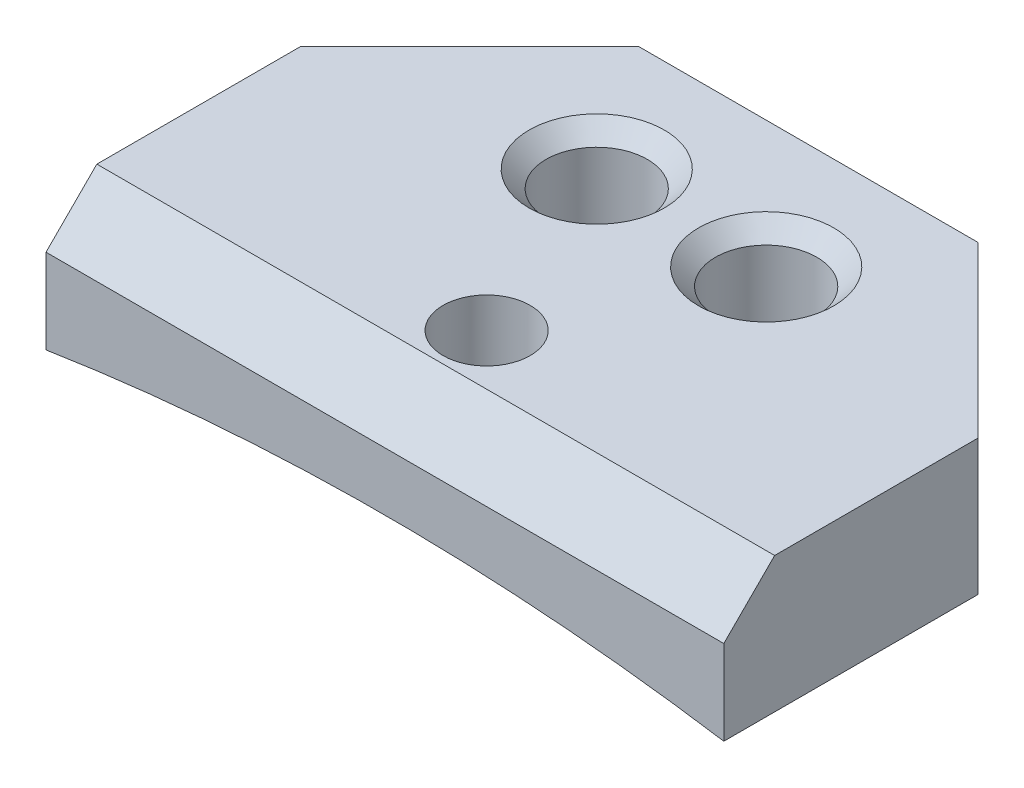
ISO-10303-21;
HEADER;
FILE_DESCRIPTION(('STEP AP214'),'2;1');
FILE_NAME('part.step','',(''),(''),'','','');
FILE_SCHEMA(('AUTOMOTIVE_DESIGN { 1 0 10303 214 1 1 1 1 }'));
ENDSEC;
DATA;
#1=APPLICATION_CONTEXT('core data for automotive mechanical design processes');
#2=APPLICATION_PROTOCOL_DEFINITION('international standard','automotive_design',2000,#1);
#3=PRODUCT_CONTEXT('',#1,'mechanical');
#4=PRODUCT('Part','Part','',(#3));
#5=PRODUCT_RELATED_PRODUCT_CATEGORY('part','',(#4));
#6=PRODUCT_DEFINITION_FORMATION('','',#4);
#7=PRODUCT_DEFINITION_CONTEXT('part definition',#1,'design');
#8=PRODUCT_DEFINITION('design','',#6,#7);
#9=PRODUCT_DEFINITION_SHAPE('','',#8);
#10=(LENGTH_UNIT() NAMED_UNIT(*) SI_UNIT(.MILLI.,.METRE.));
#11=(NAMED_UNIT(*) PLANE_ANGLE_UNIT() SI_UNIT($,.RADIAN.));
#12=(NAMED_UNIT(*) SI_UNIT($,.STERADIAN.) SOLID_ANGLE_UNIT());
#13=UNCERTAINTY_MEASURE_WITH_UNIT(LENGTH_MEASURE(1.E-05),#10,'distance_accuracy_value','');
#14=(GEOMETRIC_REPRESENTATION_CONTEXT(3) GLOBAL_UNCERTAINTY_ASSIGNED_CONTEXT((#13)) GLOBAL_UNIT_ASSIGNED_CONTEXT((#10,
#11,#12)) REPRESENTATION_CONTEXT('',''));
#15=CARTESIAN_POINT('',(0.,0.,0.));
#16=DIRECTION('',(0.,0.,1.));
#17=DIRECTION('',(1.,0.,0.));
#18=AXIS2_PLACEMENT_3D('',#15,#16,#17);
#19=CARTESIAN_POINT('',(-15.8118256986195,-82.8522926659245,20.4922288865617));
#20=DIRECTION('',(0.,0.,-1.));
#21=DIRECTION('',(-1.,0.,0.));
#22=AXIS2_PLACEMENT_3D('',#19,#20,#21);
#23=CYLINDRICAL_SURFACE('',#22,81.9404);
#24=CARTESIAN_POINT('',(-15.810045420452,-0.911892685264051,18.3141788865616));
#25=CARTESIAN_POINT('',(-15.9017029918076,-0.911890913280541,18.3141748249464));
#26=CARTESIAN_POINT('',(-15.9934267954014,-0.912044142317425,18.3064311269966));
#27=CARTESIAN_POINT('',(-16.1743476192574,-0.912644500400301,18.2756478088611));
#28=CARTESIAN_POINT('',(-16.2635414743436,-0.913091982007552,18.2525898394161));
#29=CARTESIAN_POINT('',(-16.4367551740045,-0.914229998136399,18.1918352434671));
#30=CARTESIAN_POINT('',(-16.5207774935506,-0.914920415315425,18.1541456833975));
#31=CARTESIAN_POINT('',(-16.6812787169512,-0.916466232669863,18.0652076708666));
#32=CARTESIAN_POINT('',(-16.7577594750399,-0.917321592137491,18.0139625627589));
#33=CARTESIAN_POINT('',(-16.9010518371877,-0.919101082150089,17.8993502572498));
#34=CARTESIAN_POINT('',(-16.9678612293931,-0.92002522835373,17.8359802945481));
#35=CARTESIAN_POINT('',(-17.0898960764751,-0.921837872119632,17.6989210773848));
#36=CARTESIAN_POINT('',(-17.1451210736124,-0.922726368272116,17.625231415348));
#37=CARTESIAN_POINT('',(-17.2424197786345,-0.924367454272636,17.4696204298715));
#38=CARTESIAN_POINT('',(-17.2844926361657,-0.925120035331733,17.3876985746303));
#39=CARTESIAN_POINT('',(-17.354287036228,-0.926404262754413,17.217952555162));
#40=CARTESIAN_POINT('',(-17.3820086202216,-0.9269359097563,17.1301284079881));
#41=CARTESIAN_POINT('',(-17.4223101287402,-0.927718192822541,16.951083046461));
#42=CARTESIAN_POINT('',(-17.4348920541042,-0.927968866019757,16.8598622826437));
#43=CARTESIAN_POINT('',(-17.4445632358803,-0.92816102707526,16.6766030428427));
#44=CARTESIAN_POINT('',(-17.4416525351291,-0.928102515788437,16.5845645691206));
#45=CARTESIAN_POINT('',(-17.4204228337145,-0.927682946116929,16.4022961558621));
#46=CARTESIAN_POINT('',(-17.402106011651,-0.927321930509808,16.3120659624612));
#47=CARTESIAN_POINT('',(-17.3505873758904,-0.926338152579295,16.1359615106388));
#48=CARTESIAN_POINT('',(-17.317385538961,-0.925715389847375,16.0500872590161));
#49=CARTESIAN_POINT('',(-17.2370368615322,-0.924278337233449,15.8851254307001));
#50=CARTESIAN_POINT('',(-17.1898890216518,-0.923464033626336,15.8060383409042));
#51=CARTESIAN_POINT('',(-17.0829874678764,-0.921735802429861,15.6569012197233));
#52=CARTESIAN_POINT('',(-17.0232337441657,-0.920821874762924,15.5868511953753));
#53=CARTESIAN_POINT('',(-16.8928042780576,-0.918997347350935,15.4577639643707));
#54=CARTESIAN_POINT('',(-16.8221266432536,-0.918086748210534,15.3987286697722));
#55=CARTESIAN_POINT('',(-16.6718623410035,-0.916371818706652,15.2933614343471));
#56=CARTESIAN_POINT('',(-16.5922756723002,-0.915567488358166,15.2470294953128));
#57=CARTESIAN_POINT('',(-16.4264514968363,-0.914155914546316,15.1683844274501));
#58=CARTESIAN_POINT('',(-16.3402139645768,-0.913548671838614,15.1360713523718));
#59=CARTESIAN_POINT('',(-16.1635365230143,-0.912599902052049,15.086382468046));
#60=CARTESIAN_POINT('',(-16.0730966188571,-0.912258374647819,15.0690066405078));
#61=CARTESIAN_POINT('',(-15.8905983716079,-0.911879743399274,15.049687832766));
#62=CARTESIAN_POINT('',(-15.7985403090942,-0.911842587290676,15.0477422030101));
#63=CARTESIAN_POINT('',(-15.6154043620863,-0.912076918082261,15.0593321160648));
#64=CARTESIAN_POINT('',(-15.5243264771189,-0.912348404833392,15.0728676513993));
#65=CARTESIAN_POINT('',(-15.3457436340813,-0.913169551451484,15.1150334773267));
#66=CARTESIAN_POINT('',(-15.2582383936558,-0.913719189289282,15.1436625725391));
#67=CARTESIAN_POINT('',(-15.0892761684698,-0.915034845140963,15.2152016111763));
#68=CARTESIAN_POINT('',(-15.0078191886493,-0.915800863331578,15.2581115662651));
#69=CARTESIAN_POINT('',(-14.85325354451,-0.917463228052602,15.357001101786));
#70=CARTESIAN_POINT('',(-14.7801460252889,-0.918359592421281,15.412982471717));
#71=CARTESIAN_POINT('',(-14.6443660696722,-0.920181682170382,15.5364230907153));
#72=CARTESIAN_POINT('',(-14.5816936473735,-0.921107407590468,15.6038823552881));
#73=CARTESIAN_POINT('',(-14.4685541355325,-0.922884118180135,15.7483751625375));
#74=CARTESIAN_POINT('',(-14.4180887565541,-0.923735092864323,15.8254100447514));
#75=CARTESIAN_POINT('',(-14.3308076008595,-0.925266287412075,15.9868604175185));
#76=CARTESIAN_POINT('',(-14.2939918024863,-0.925946507546564,16.0712758963612));
#77=CARTESIAN_POINT('',(-14.2350578659797,-0.92705949477823,16.2450847055307));
#78=CARTESIAN_POINT('',(-14.2129386086681,-0.927492280717788,16.3344776562487));
#79=CARTESIAN_POINT('',(-14.1840219584635,-0.928061699279848,16.5157093241088));
#80=CARTESIAN_POINT('',(-14.1772245750549,-0.928198331719031,16.6075480427649));
#81=CARTESIAN_POINT('',(-14.1791447913573,-0.928160043683647,16.7910469123331));
#82=CARTESIAN_POINT('',(-14.1878596735206,-0.927985177779546,16.8827070917068));
#83=CARTESIAN_POINT('',(-14.2205514797717,-0.927343705269266,17.0632631870278));
#84=CARTESIAN_POINT('',(-14.2445284343718,-0.92687709807983,17.1521590974483));
#85=CARTESIAN_POINT('',(-14.3070637056319,-0.925704704487211,17.3246650418412));
#86=CARTESIAN_POINT('',(-14.3456222858023,-0.924998913761672,17.4082749802569));
#87=CARTESIAN_POINT('',(-14.4362244097058,-0.923427685215007,17.5678320664825));
#88=CARTESIAN_POINT('',(-14.4882674424335,-0.92256225344398,17.6437795045183));
#89=CARTESIAN_POINT('',(-14.6043656332835,-0.920769101466156,17.785866021643));
#90=CARTESIAN_POINT('',(-14.668421617403,-0.919841376978998,17.8520044257132));
#91=CARTESIAN_POINT('',(-14.8067466642237,-0.918027905096621,17.9726058679948));
#92=CARTESIAN_POINT('',(-14.8810182572159,-0.917142168174562,18.0270660050524));
#93=CARTESIAN_POINT('',(-15.0376862570101,-0.915512178640701,18.1227692620854));
#94=CARTESIAN_POINT('',(-15.1200871326344,-0.914768004514252,18.1640050588505));
#95=CARTESIAN_POINT('',(-15.2905796160932,-0.913506418905138,18.2320095105708));
#96=CARTESIAN_POINT('',(-15.3786642756437,-0.912988736350335,18.2587954685417));
#97=CARTESIAN_POINT('',(-15.5244310144212,-0.912377327161624,18.2900186907092));
#98=CARTESIAN_POINT('',(-15.5811663721117,-0.912197456155807,18.2990674159196));
#99=CARTESIAN_POINT('',(-15.6952743021591,-0.911955690047492,18.3111487852098));
#100=CARTESIAN_POINT('',(-15.7526468744345,-0.911893794929904,18.3141814300592));
#101=CARTESIAN_POINT('',(-15.810045420452,-0.911892685264051,18.3141788865616));
#102=B_SPLINE_CURVE_WITH_KNOTS('',3,(#24,#25,#26,#27,#28,#29,#30,#31,#32,#33,#34,#35,#36,#37,
#38,#39,#40,#41,#42,#43,#44,#45,#46,#47,#48,#49,#50,#51,#52,#53,#54,#55,#56,#57,#58,#59,#60,#61,
#62,#63,#64,#65,#66,#67,#68,#69,#70,#71,#72,#73,#74,#75,#76,#77,#78,#79,#80,#81,#82,#83,#84,#85,
#86,#87,#88,#89,#90,#91,#92,#93,#94,#95,#96,#97,#98,#99,#100,#101),.UNSPECIFIED.,.T.,.F.,(4,2,2,
2,2,2,2,2,2,2,2,2,2,2,2,2,2,2,2,2,2,2,2,2,2,2,2,2,2,2,2,2,2,2,2,2,2,2,4),(0.,0.274763206328043,
0.549856223885478,0.824816548196743,1.09970909890805,1.37466441891012,1.64963060130168,
1.92461455800011,2.19959772023139,2.47454453702401,2.74949059359428,3.02439777621472,
3.29930538790436,3.57423270445488,3.84916023508528,4.12413544635317,4.39911069641876,
4.6740870007649,4.94906296840348,5.22399171830816,5.49892033544355,5.7738271820375,
6.04873425316546,6.32367898162749,6.59862408151416,6.87360768696566,7.14859085611537,
7.42355308221037,7.69851547850699,7.97342970969799,8.24834449050649,8.52326423964413,
8.79817357197255,9.07310181369634,9.34809827508421,9.62324675867547,9.89806502913822,
10.0701294895678,10.2421939279889),.UNSPECIFIED.);
#103=CARTESIAN_POINT('',(-15.810045420452,-0.911892685264051,18.3141788865616));
#104=VERTEX_POINT('',#103);
#105=EDGE_CURVE('E186',#104,#104,#102,.T.);
#106=ORIENTED_EDGE('',*,*,#105,.F.);
#107=EDGE_LOOP('',(#106));
#108=FACE_BOUND('',#107,.T.);
#109=CARTESIAN_POINT('',(-18.9868256986196,-0.973427705789592,11.2783788865617));
#110=CARTESIAN_POINT('',(-19.0935780132157,-0.97756751737105,11.2783741575402));
#111=CARTESIAN_POINT('',(-19.20039953097,-0.981920747242766,11.2693454514336));
#112=CARTESIAN_POINT('',(-19.4110839792511,-0.990911979678839,11.2334607602283));
#113=CARTESIAN_POINT('',(-19.5149431752069,-0.995550320298223,11.2065832268438));
#114=CARTESIAN_POINT('',(-19.7166221828368,-1.00492310898969,11.135769990621));
#115=CARTESIAN_POINT('',(-19.8144449490277,-1.00965750851371,11.0918427107357));
#116=CARTESIAN_POINT('',(-20.0012968140726,-1.01900942337175,10.988185852745));
#117=CARTESIAN_POINT('',(-20.0903280880472,-1.0236269674059,10.9284601968681));
#118=CARTESIAN_POINT('',(-20.2571243503675,-1.03251839619577,10.794872726684));
#119=CARTESIAN_POINT('',(-20.3348864147835,-1.03679219163433,10.7210072551315));
#120=CARTESIAN_POINT('',(-20.4769048358816,-1.04476696513993,10.5612365696443));
#121=CARTESIAN_POINT('',(-20.5411607190342,-1.04846792312199,10.4753309337549));
#122=CARTESIAN_POINT('',(-20.6542724136844,-1.05508561788713,10.2940048828285));
#123=CARTESIAN_POINT('',(-20.7031429456756,-1.05800310389013,10.1985936783895));
#124=CARTESIAN_POINT('',(-20.7841666259622,-1.06288849269704,10.0008965678014));
#125=CARTESIAN_POINT('',(-20.8163199806518,-1.06485640722455,9.89861074654552));
#126=CARTESIAN_POINT('',(-20.8629453088872,-1.0677226464383,9.69025223704612));
#127=CARTESIAN_POINT('',(-20.8774469422756,-1.06862276525592,9.58418621021337));
#128=CARTESIAN_POINT('',(-20.8884505006226,-1.06930504187572,9.37112155445355));
#129=CARTESIAN_POINT('',(-20.8849525962,-1.06908721027503,9.2641229343762));
#130=CARTESIAN_POINT('',(-20.8600714577444,-1.06754764168445,9.05234997812022));
#131=CARTESIAN_POINT('',(-20.8387072254592,-1.0662270775089,8.94757340002997));
#132=CARTESIAN_POINT('',(-20.7787310657984,-1.06256288053438,8.74309797676355));
#133=CARTESIAN_POINT('',(-20.7401190905675,-1.06021924489681,8.6433991456769));
#134=CARTESIAN_POINT('',(-20.6467269926139,-1.05464563314802,8.45185030848569));
#135=CARTESIAN_POINT('',(-20.5919386045299,-1.0514152039878,8.36000434582912));
#136=CARTESIAN_POINT('',(-20.4677613978162,-1.04425351457561,8.18680991851986));
#137=CARTESIAN_POINT('',(-20.3983724533756,-1.04032224828466,8.10546154433315));
#138=CARTESIAN_POINT('',(-20.2468384319519,-1.03196775952616,7.95543045766894));
#139=CARTESIAN_POINT('',(-20.1646728793136,-1.0275437506812,7.88676846965116));
#140=CARTESIAN_POINT('',(-19.9899958067058,-1.01843852998746,7.76420882644725));
#141=CARTESIAN_POINT('',(-19.8974842002367,-1.01375731598844,7.71031129471426));
#142=CARTESIAN_POINT('',(-19.7046009982673,-1.00435575041526,7.61873970004816));
#143=CARTESIAN_POINT('',(-19.6042190001358,-0.999635354675414,7.58108755153035));
#144=CARTESIAN_POINT('',(-19.3985486822549,-0.990365252746965,7.52318117564265));
#145=CARTESIAN_POINT('',(-19.2932603545875,-0.985815546833847,7.50292697635114));
#146=CARTESIAN_POINT('',(-19.080744747859,-0.977054472472032,7.48039464972604));
#147=CARTESIAN_POINT('',(-18.9735171380422,-0.97284316241825,7.47811961838225));
#148=CARTESIAN_POINT('',(-18.7601877788388,-0.964883939118469,7.49162669124361));
#149=CARTESIAN_POINT('',(-18.6540860253358,-0.961136024177677,7.50740872940573));
#150=CARTESIAN_POINT('',(-18.4461043629616,-0.954181865277632,7.55657165075671));
#151=CARTESIAN_POINT('',(-18.3442214380851,-0.950975229135061,7.58993971910442));
#152=CARTESIAN_POINT('',(-18.1474962032247,-0.945128821414048,7.67332589210366));
#153=CARTESIAN_POINT('',(-18.0526538621515,-0.942489047332404,7.72334392322827));
#154=CARTESIAN_POINT('',(-17.8727837085343,-0.937765843819103,7.83856675599081));
#155=CARTESIAN_POINT('',(-17.7877481916009,-0.935681975945444,7.90375951290566));
#156=CARTESIAN_POINT('',(-17.6298252674177,-0.932024833279389,8.04750438091694));
#157=CARTESIAN_POINT('',(-17.556937838914,-0.930451557593671,8.12605646863978));
#158=CARTESIAN_POINT('',(-17.4254108508343,-0.927755232867882,8.29425714394612));
#159=CARTESIAN_POINT('',(-17.366765855858,-0.926632011964803,8.38390147857015));
#160=CARTESIAN_POINT('',(-17.2653550197623,-0.924769890171664,8.57176554640928));
#161=CARTESIAN_POINT('',(-17.2225891551806,-0.924030988713751,8.66998526695353));
#162=CARTESIAN_POINT('',(-17.1541541507512,-0.922881060553615,8.87220529116325));
#163=CARTESIAN_POINT('',(-17.1284839384238,-0.92247001328345,8.97620523176849));
#164=CARTESIAN_POINT('',(-17.0949651787969,-0.921938153786775,9.18703936727604));
#165=CARTESIAN_POINT('',(-17.0871166654153,-0.921817342112637,9.29387356757205));
#166=CARTESIAN_POINT('',(-17.0894643770058,-0.921853922754616,9.50734555810517));
#167=CARTESIAN_POINT('',(-17.0996609540591,-0.922011320498928,9.61398334446937));
#168=CARTESIAN_POINT('',(-17.1378099256241,-0.922619915274681,9.82403351247431));
#169=CARTESIAN_POINT('',(-17.1657623554903,-0.923071112891118,9.92744588769238));
#170=CARTESIAN_POINT('',(-17.2386294854668,-0.924307812817867,10.1281112295768));
#171=CARTESIAN_POINT('',(-17.2835445025442,-0.925093321375234,10.225364081105));
#172=CARTESIAN_POINT('',(-17.3890583588617,-0.927056863389014,10.4109436737983));
#173=CARTESIAN_POINT('',(-17.4496565768215,-0.928234881296945,10.4992707683589));
#174=CARTESIAN_POINT('',(-17.5848052768372,-0.931048471295617,10.6644856794167));
#175=CARTESIAN_POINT('',(-17.6593539955078,-0.932683985570351,10.7413749394882));
#176=CARTESIAN_POINT('',(-17.8203128312877,-0.936472474375315,10.881564674361));
#177=CARTESIAN_POINT('',(-17.9067258713206,-0.938625576518226,10.9448617906845));
#178=CARTESIAN_POINT('',(-18.0889764373742,-0.943489442298438,11.0560778506439));
#179=CARTESIAN_POINT('',(-18.1848189811389,-0.94620050369084,11.103988548215));
#180=CARTESIAN_POINT('',(-18.3830946182968,-0.952185678018752,11.1829879816607));
#181=CARTESIAN_POINT('',(-18.4855196917557,-0.95545911362139,11.2140967693976));
#182=CARTESIAN_POINT('',(-18.6549658958519,-0.961206514921339,11.2503440101633));
#183=CARTESIAN_POINT('',(-18.7208936801983,-0.963521302737975,11.2608444931476));
#184=CARTESIAN_POINT('',(-18.8534805410609,-0.96833886856453,11.2748634076477));
#185=CARTESIAN_POINT('',(-18.9201396174171,-0.970841646533377,11.2783818406889));
#186=CARTESIAN_POINT('',(-18.9868256986196,-0.973427705789592,11.2783788865617));
#187=B_SPLINE_CURVE_WITH_KNOTS('',3,(#109,#110,#111,#112,#113,#114,#115,#116,#117,#118,#119,
#120,#121,#122,#123,#124,#125,#126,#127,#128,#129,#130,#131,#132,#133,#134,#135,#136,#137,#138,
#139,#140,#141,#142,#143,#144,#145,#146,#147,#148,#149,#150,#151,#152,#153,#154,#155,#156,#157,
#158,#159,#160,#161,#162,#163,#164,#165,#166,#167,#168,#169,#170,#171,#172,#173,#174,#175,#176,
#177,#178,#179,#180,#181,#182,#183,#184,#185,#186),.UNSPECIFIED.,.T.,.F.,(4,2,2,2,2,2,2,2,2,2,2,
2,2,2,2,2,2,2,2,2,2,2,2,2,2,2,2,2,2,2,2,2,2,2,2,2,2,2,4),(0.,0.320253945741617,
0.640895227833264,0.961378307220983,1.28178189552623,1.60226846805755,1.92276627504161,
2.24295649553775,2.56314276279501,2.88279028133575,3.20243476992114,3.52173973205552,
3.84104558013533,4.16051486116953,4.4799868951378,4.79997629087942,5.11996836213384,
5.44039075132573,5.76081365764347,6.08129173917525,6.4017686485748,6.72201235048707,
7.0422546382088,7.3622435997589,7.68223200145995,8.00209809204783,8.32196371001521,
8.64180925962361,8.9616554179555,9.28150781693381,9.60136085278531,9.92121986578742,
10.2410662097118,10.560872151368,10.8807570230562,11.2008130460953,11.5204862566852,
11.7205426711785,11.9205990419646),.UNSPECIFIED.);
#188=CARTESIAN_POINT('',(-18.9868256986196,-0.973427705789592,11.2783788865617));
#189=VERTEX_POINT('',#188);
#190=EDGE_CURVE('E157',#189,#189,#187,.T.);
#191=ORIENTED_EDGE('',*,*,#190,.F.);
#192=EDGE_LOOP('',(#191));
#193=FACE_BOUND('',#192,.T.);
#194=CARTESIAN_POINT('',(-12.6368256986196,-0.973427705789592,11.2783788865617));
#195=CARTESIAN_POINT('',(-12.7434577472776,-0.969293153231222,11.2783741818191));
#196=CARTESIAN_POINT('',(-12.8501745116819,-0.965365573298108,11.2693658928946));
#197=CARTESIAN_POINT('',(-13.0606856767007,-0.958022347731832,11.23354647341));
#198=CARTESIAN_POINT('',(-13.1644764541522,-0.954607315947932,11.2067142014164));
#199=CARTESIAN_POINT('',(-13.3660558017562,-0.948339605129794,11.1360015590587));
#200=CARTESIAN_POINT('',(-13.4638470119349,-0.945486677509368,11.0921287503616));
#201=CARTESIAN_POINT('',(-13.6506566341313,-0.940344553375364,10.9885863581384));
#202=CARTESIAN_POINT('',(-13.7396772016585,-0.938055218142659,10.9289206692917));
#203=CARTESIAN_POINT('',(-13.906409945034,-0.934007117617322,10.7955052161074));
#204=CARTESIAN_POINT('',(-13.9841264241488,-0.932248150148009,10.7217608361322));
#205=CARTESIAN_POINT('',(-14.1260819430054,-0.929203890342608,10.5622626118063));
#206=CARTESIAN_POINT('',(-14.1903204794158,-0.927918615695143,10.4765083191469));
#207=CARTESIAN_POINT('',(-14.3034734801665,-0.925757041982718,10.2954526636771));
#208=CARTESIAN_POINT('',(-14.3523921563377,-0.924880630478067,10.2001539344085));
#209=CARTESIAN_POINT('',(-14.4335389534198,-0.92347518224931,10.0026951616181));
#210=CARTESIAN_POINT('',(-14.4657671104666,-0.92294614477312,9.90053513295197));
#211=CARTESIAN_POINT('',(-14.5126169675773,-0.92218975113438,9.69225513910518));
#212=CARTESIAN_POINT('',(-14.5272389048702,-0.921962390906979,9.5861352273005));
#213=CARTESIAN_POINT('',(-14.538461740074,-0.921787178986047,9.37294667507438));
#214=CARTESIAN_POINT('',(-14.5350626676121,-0.921839326832996,9.26587803621296));
#215=CARTESIAN_POINT('',(-14.5103398550484,-0.922228364613564,9.05382896898975));
#216=CARTESIAN_POINT('',(-14.4890157588743,-0.922565260203569,8.94884858215256));
#217=CARTESIAN_POINT('',(-14.429048224509,-0.923555519453723,8.74395826777516));
#218=CARTESIAN_POINT('',(-14.3904047708595,-0.924208883396337,8.6440483447607));
#219=CARTESIAN_POINT('',(-14.2968971600403,-0.925884717368941,8.45213635275564));
#220=CARTESIAN_POINT('',(-14.2420331713424,-0.926907183565341,8.3601342016452));
#221=CARTESIAN_POINT('',(-14.1176440302423,-0.929385263976451,8.18664826205894));
#222=CARTESIAN_POINT('',(-14.0481188934899,-0.930840877728808,8.10516446235564));
#223=CARTESIAN_POINT('',(-13.896385623433,-0.934248340168745,7.95502842878998));
#224=CARTESIAN_POINT('',(-13.8141776815466,-0.936200181367191,7.88637600130181));
#225=CARTESIAN_POINT('',(-13.6394160294974,-0.940648708999969,7.76384733252902));
#226=CARTESIAN_POINT('',(-13.5468623206365,-0.943145395365747,7.70997108938517));
#227=CARTESIAN_POINT('',(-13.3540278248156,-0.948704977335502,7.6185128647601));
#228=CARTESIAN_POINT('',(-13.2537460241866,-0.951767947291053,7.58093302512476));
#229=CARTESIAN_POINT('',(-13.048315389814,-0.958442363034149,7.52313692624492));
#230=CARTESIAN_POINT('',(-12.9431665447401,-0.962053810098569,7.5029207074243));
#231=CARTESIAN_POINT('',(-12.7309302371395,-0.969763918223472,7.48041063945442));
#232=CARTESIAN_POINT('',(-12.6238417982872,-0.973862830780467,7.4781260828091));
#233=CARTESIAN_POINT('',(-12.4108153005615,-0.982434684749997,7.49156005928705));
#234=CARTESIAN_POINT('',(-12.3048772481418,-0.986907628259642,7.50727869335656));
#235=CARTESIAN_POINT('',(-12.0970613769107,-0.996074140424325,7.55628891080414));
#236=CARTESIAN_POINT('',(-11.9951870991008,-1.00076789404522,7.58959547470862));
#237=CARTESIAN_POINT('',(-11.7984797791091,-1.01017690441462,7.67284455275848));
#238=CARTESIAN_POINT('',(-11.7036467701719,-1.01489216126453,7.72278714544317));
#239=CARTESIAN_POINT('',(-11.5236599249485,-1.02412561192219,7.83792702223747));
#240=CARTESIAN_POINT('',(-11.4385113496367,-1.02864369780519,7.90313253952374));
#241=CARTESIAN_POINT('',(-11.2803720093208,-1.03724903711523,8.04693961382886));
#242=CARTESIAN_POINT('',(-11.2073812280223,-1.04133629111969,8.12554115289345));
#243=CARTESIAN_POINT('',(-11.0756744607473,-1.04885517381618,8.29386862884127));
#244=CARTESIAN_POINT('',(-11.0169506302982,-1.05228716257284,8.38358841135377));
#245=CARTESIAN_POINT('',(-10.9154057699978,-1.05830252782342,8.5716423712253));
#246=CARTESIAN_POINT('',(-10.8725845771298,-1.06088591301628,8.66997646026695));
#247=CARTESIAN_POINT('',(-10.8041287970545,-1.06504851174781,8.87230253535315));
#248=CARTESIAN_POINT('',(-10.7784672481228,-1.06662930039257,8.97628536661455));
#249=CARTESIAN_POINT('',(-10.74496052575,-1.0686982492668,9.18709349835229));
#250=CARTESIAN_POINT('',(-10.7371152144166,-1.06918641795282,9.29391877682247));
#251=CARTESIAN_POINT('',(-10.739464923872,-1.06904065674332,9.50721832831279));
#252=CARTESIAN_POINT('',(-10.7496344714214,-1.06840831126869,9.61369288401389));
#253=CARTESIAN_POINT('',(-10.7876722821778,-1.06606281757224,9.82341966400849));
#254=CARTESIAN_POINT('',(-10.8155405551108,-1.0643496687565,9.92667188653118));
#255=CARTESIAN_POINT('',(-10.8881775694221,-1.05994488053872,10.1270284134902));
#256=CARTESIAN_POINT('',(-10.9329465410702,-1.0572532278047,10.2241326341398));
#257=CARTESIAN_POINT('',(-11.0381051966494,-1.05104874628266,10.4094443398225));
#258=CARTESIAN_POINT('',(-11.0984943879818,-1.04753594339073,10.497652105292));
#259=CARTESIAN_POINT('',(-11.2332653376285,-1.03988232528848,10.6627972761107));
#260=CARTESIAN_POINT('',(-11.3076651714934,-1.03574070016815,10.7397198915003));
#261=CARTESIAN_POINT('',(-11.4683195388862,-1.02705472814965,10.8800085700816));
#262=CARTESIAN_POINT('',(-11.5545771037817,-1.02251027837729,10.9433711560975));
#263=CARTESIAN_POINT('',(-11.7366664838752,-1.01323993588602,11.0548435753016));
#264=CARTESIAN_POINT('',(-11.8325175834235,-1.00851368996043,11.1029218410314));
#265=CARTESIAN_POINT('',(-12.0308602200065,-0.999111491469665,11.1822437653821));
#266=CARTESIAN_POINT('',(-12.1333437116254,-0.994435485705257,11.213507407506));
#267=CARTESIAN_POINT('',(-12.3031973961863,-0.98701913734518,11.2500417010354));
#268=CARTESIAN_POINT('',(-12.3694629990266,-0.984205237084579,11.2606543328051));
#269=CARTESIAN_POINT('',(-12.5027498003917,-0.978709511189151,11.27482440718));
#270=CARTESIAN_POINT('',(-12.5697709994183,-0.976027685642013,11.2783818451009));
#271=CARTESIAN_POINT('',(-12.6368256986196,-0.973427705789592,11.2783788865617));
#272=B_SPLINE_CURVE_WITH_KNOTS('',3,(#194,#195,#196,#197,#198,#199,#200,#201,#202,#203,#204,
#205,#206,#207,#208,#209,#210,#211,#212,#213,#214,#215,#216,#217,#218,#219,#220,#221,#222,#223,
#224,#225,#226,#227,#228,#229,#230,#231,#232,#233,#234,#235,#236,#237,#238,#239,#240,#241,#242,
#243,#244,#245,#246,#247,#248,#249,#250,#251,#252,#253,#254,#255,#256,#257,#258,#259,#260,#261,
#262,#263,#264,#265,#266,#267,#268,#269,#270,#271),.UNSPECIFIED.,.T.,.F.,(4,2,2,2,2,2,2,2,2,2,2,
2,2,2,2,2,2,2,2,2,2,2,2,2,2,2,2,2,2,2,2,2,2,2,2,2,2,2,4),(0.,0.319891903362707,
0.640163916948047,0.960293973235597,1.28034515574371,1.60027417975074,1.92021514932688,
2.24006808137296,2.55992032091632,2.87976825067239,3.19961565458903,3.51946941228059,
3.83932345545961,4.15917417664869,4.47902455642038,4.79887010925039,5.11871562183562,
5.43860315917296,5.75849144123165,6.07854548410834,6.39860132157849,6.71893020749485,
7.03926060571712,7.3597641974409,7.6802673596072,8.00059389697137,8.32091715060173,
8.64073591306963,8.96055220022912,9.2799166240027,9.59928122327764,9.91865017401266,
10.2380090543695,10.557782807461,10.8776384616116,11.198150500978,11.5182807782264,
11.719442074339,11.9206035040109),.UNSPECIFIED.);
#273=CARTESIAN_POINT('',(-12.6368256986196,-0.973427705789592,11.2783788865617));
#274=VERTEX_POINT('',#273);
#275=EDGE_CURVE('E116',#274,#274,#272,.T.);
#276=ORIENTED_EDGE('',*,*,#275,.F.);
#277=EDGE_LOOP('',(#276));
#278=FACE_BOUND('',#277,.T.);
#279=DIRECTION('',(0.,0.,-1.));
#280=VECTOR('',#279,1.);
#281=CARTESIAN_POINT('',(-28.5118256986195,-1.90206627859432,20.4922288865617));
#282=LINE('',#281,#280);
#283=CARTESIAN_POINT('',(-28.5118256986195,-1.90206627859432,20.4922288865617));
#284=VERTEX_POINT('',#283);
#285=CARTESIAN_POINT('',(-28.5118256986195,-1.90206627859432,10.9672288865618));
#286=VERTEX_POINT('',#285);
#287=EDGE_CURVE('E94',#284,#286,#282,.T.);
#288=ORIENTED_EDGE('',*,*,#287,.T.);
#289=CARTESIAN_POINT('',(-15.8118256986195,-82.8522926659245,-1.73277111343835));
#290=DIRECTION('',(0.70710678118655,0.,0.707106781186545));
#291=DIRECTION('',(0.707106781186545,0.,-0.70710678118655));
#292=AXIS2_PLACEMENT_3D('',#289,#290,#291);
#293=ELLIPSE('',#292,115.881224986277,81.9404);
#294=CARTESIAN_POINT('',(-22.1618256986195,-1.15831092822238,4.61722888656171));
#295=VERTEX_POINT('',#294);
#296=EDGE_CURVE('E145',#286,#295,#293,.F.);
#297=ORIENTED_EDGE('',*,*,#296,.T.);
#298=CARTESIAN_POINT('',(-15.8118256986195,-82.8522926659245,4.61722888656171));
#299=DIRECTION('',(0.,0.,1.));
#300=DIRECTION('',(1.,0.,0.));
#301=AXIS2_PLACEMENT_3D('',#298,#299,#300);
#302=CIRCLE('',#301,81.9404);
#303=CARTESIAN_POINT('',(-9.46182569861957,-1.15831092822237,4.61722888656171));
#304=VERTEX_POINT('',#303);
#305=EDGE_CURVE('E113',#304,#295,#302,.T.);
#306=ORIENTED_EDGE('',*,*,#305,.F.);
#307=CARTESIAN_POINT('',(-15.8118256986195,-82.8522926659245,-1.73277111343825));
#308=DIRECTION('',(-0.70710678118655,0.,0.707106781186545));
#309=DIRECTION('',(-0.707106781186545,0.,-0.70710678118655));
#310=AXIS2_PLACEMENT_3D('',#307,#308,#309);
#311=ELLIPSE('',#310,115.881224986277,81.9404);
#312=CARTESIAN_POINT('',(-3.11182569861947,-1.90206627859432,10.9672288865619));
#313=VERTEX_POINT('',#312);
#314=EDGE_CURVE('E143',#304,#313,#311,.F.);
#315=ORIENTED_EDGE('',*,*,#314,.T.);
#316=DIRECTION('',(0.,0.,-1.));
#317=VECTOR('',#316,1.);
#318=CARTESIAN_POINT('',(-3.11182569861947,-1.90206627859432,20.4922288865617));
#319=LINE('',#318,#317);
#320=CARTESIAN_POINT('',(-3.11182569861947,-1.90206627859432,20.4922288865617));
#321=VERTEX_POINT('',#320);
#322=EDGE_CURVE('E104',#321,#313,#319,.T.);
#323=ORIENTED_EDGE('',*,*,#322,.F.);
#324=CARTESIAN_POINT('',(-15.8118256986195,-82.8522926659245,20.4922288865617));
#325=DIRECTION('',(0.,0.,1.));
#326=DIRECTION('',(1.,0.,0.));
#327=AXIS2_PLACEMENT_3D('',#324,#325,#326);
#328=CIRCLE('',#327,81.9404);
#329=EDGE_CURVE('E109',#321,#284,#328,.T.);
#330=ORIENTED_EDGE('',*,*,#329,.T.);
#331=EDGE_LOOP('',(#288,#297,#306,#315,#323,#330));
#332=FACE_BOUND('',#331,.T.);
#333=ADVANCED_FACE('F37',(#108,#193,#278,#332),#23,.F.);
#334=CARTESIAN_POINT('',(-15.8118256986195,-82.8522926659245,20.4922288865617));
#335=DIRECTION('',(0.,0.,1.));
#336=DIRECTION('',(1.,0.,0.));
#337=AXIS2_PLACEMENT_3D('',#334,#335,#336);
#338=PLANE('',#337);
#339=DIRECTION('',(0.,-1.,0.));
#340=VECTOR('',#339,1.);
#341=CARTESIAN_POINT('',(-3.11182569861947,3.175,20.4922288865617));
#342=LINE('',#341,#340);
#343=CARTESIAN_POINT('',(-3.11182569861952,1.26999999999999,20.4922288865617));
#344=VERTEX_POINT('',#343);
#345=EDGE_CURVE('E105',#344,#321,#342,.T.);
#346=ORIENTED_EDGE('',*,*,#345,.F.);
#347=DIRECTION('',(-1.,0.,0.));
#348=VECTOR('',#347,1.);
#349=CARTESIAN_POINT('',(-15.8118256986195,1.26999999999999,20.4922288865617));
#350=LINE('',#349,#348);
#351=CARTESIAN_POINT('',(-28.5118256986195,1.26999999999999,20.4922288865617));
#352=VERTEX_POINT('',#351);
#353=EDGE_CURVE('E45',#344,#352,#350,.T.);
#354=ORIENTED_EDGE('',*,*,#353,.T.);
#355=DIRECTION('',(0.,1.,0.));
#356=VECTOR('',#355,1.);
#357=CARTESIAN_POINT('',(-28.5118256986195,-1.90206627859432,20.4922288865617));
#358=LINE('',#357,#356);
#359=EDGE_CURVE('E96',#284,#352,#358,.T.);
#360=ORIENTED_EDGE('',*,*,#359,.F.);
#361=ORIENTED_EDGE('',*,*,#329,.F.);
#362=EDGE_LOOP('',(#346,#354,#360,#361));
#363=FACE_BOUND('',#362,.T.);
#364=ADVANCED_FACE('F108',(#363),#338,.T.);
#365=CARTESIAN_POINT('',(-22.1618256986195,3.175,4.61722888656171));
#366=DIRECTION('',(0.,0.,1.));
#367=DIRECTION('',(1.,0.,0.));
#368=AXIS2_PLACEMENT_3D('',#365,#366,#367);
#369=PLANE('',#368);
#370=ORIENTED_EDGE('',*,*,#305,.T.);
#371=DIRECTION('',(0.,1.,0.));
#372=VECTOR('',#371,1.);
#373=CARTESIAN_POINT('',(-22.1618256986195,3.175,4.61722888656171));
#374=LINE('',#373,#372);
#375=CARTESIAN_POINT('',(-22.1618256986195,3.175,4.61722888656171));
#376=VERTEX_POINT('',#375);
#377=EDGE_CURVE('E135',#295,#376,#374,.T.);
#378=ORIENTED_EDGE('',*,*,#377,.T.);
#379=DIRECTION('',(-1.,0.,0.));
#380=VECTOR('',#379,1.);
#381=CARTESIAN_POINT('',(-22.1618256986195,3.175,4.61722888656171));
#382=LINE('',#381,#380);
#383=CARTESIAN_POINT('',(-9.46182569861957,3.175,4.61722888656171));
#384=VERTEX_POINT('',#383);
#385=EDGE_CURVE('E123',#384,#376,#382,.T.);
#386=ORIENTED_EDGE('',*,*,#385,.F.);
#387=DIRECTION('',(0.,-1.,0.));
#388=VECTOR('',#387,1.);
#389=CARTESIAN_POINT('',(-9.46182569861957,3.175,4.61722888656171));
#390=LINE('',#389,#388);
#391=EDGE_CURVE('E132',#384,#304,#390,.T.);
#392=ORIENTED_EDGE('',*,*,#391,.T.);
#393=EDGE_LOOP('',(#370,#378,#386,#392));
#394=FACE_BOUND('',#393,.T.);
#395=ADVANCED_FACE('F173',(#394),#369,.F.);
#396=CARTESIAN_POINT('',(-28.5118256986195,3.175,10.9672288865617));
#397=DIRECTION('',(1.,0.,0.));
#398=DIRECTION('',(0.,0.,-1.));
#399=AXIS2_PLACEMENT_3D('',#396,#397,#398);
#400=PLANE('',#399);
#401=ORIENTED_EDGE('',*,*,#359,.T.);
#402=DIRECTION('',(0.,-0.707106781186549,0.707106781186546));
#403=VECTOR('',#402,1.);
#404=CARTESIAN_POINT('',(-28.5118256986195,3.17499999999997,18.5872288865617));
#405=LINE('',#404,#403);
#406=CARTESIAN_POINT('',(-28.5118256986195,3.175,18.5872288865617));
#407=VERTEX_POINT('',#406);
#408=EDGE_CURVE('E11',#352,#407,#405,.F.);
#409=ORIENTED_EDGE('',*,*,#408,.T.);
#410=DIRECTION('',(0.,0.,1.));
#411=VECTOR('',#410,1.);
#412=CARTESIAN_POINT('',(-28.5118256986195,3.175,10.9672288865617));
#413=LINE('',#412,#411);
#414=CARTESIAN_POINT('',(-28.5118256986195,3.175,10.9672288865618));
#415=VERTEX_POINT('',#414);
#416=EDGE_CURVE('E127',#415,#407,#413,.T.);
#417=ORIENTED_EDGE('',*,*,#416,.F.);
#418=DIRECTION('',(0.,-1.,0.));
#419=VECTOR('',#418,1.);
#420=CARTESIAN_POINT('',(-28.5118256986195,3.175,10.9672288865618));
#421=LINE('',#420,#419);
#422=EDGE_CURVE('E100',#415,#286,#421,.T.);
#423=ORIENTED_EDGE('',*,*,#422,.T.);
#424=ORIENTED_EDGE('',*,*,#287,.F.);
#425=EDGE_LOOP('',(#401,#409,#417,#423,#424));
#426=FACE_BOUND('',#425,.T.);
#427=ADVANCED_FACE('F95',(#426),#400,.F.);
#428=CARTESIAN_POINT('',(-3.11182569861947,3.175,10.9672288865617));
#429=DIRECTION('',(-1.,0.,0.));
#430=DIRECTION('',(0.,0.,1.));
#431=AXIS2_PLACEMENT_3D('',#428,#429,#430);
#432=PLANE('',#431);
#433=DIRECTION('',(0.,0.,-1.));
#434=VECTOR('',#433,1.);
#435=CARTESIAN_POINT('',(-3.11182569861947,3.175,10.9672288865617));
#436=LINE('',#435,#434);
#437=CARTESIAN_POINT('',(-3.11182569861949,3.175,18.5872288865617));
#438=VERTEX_POINT('',#437);
#439=CARTESIAN_POINT('',(-3.11182569861947,3.175,10.9672288865619));
#440=VERTEX_POINT('',#439);
#441=EDGE_CURVE('E130',#438,#440,#436,.T.);
#442=ORIENTED_EDGE('',*,*,#441,.F.);
#443=DIRECTION('',(0.,0.707106781186549,-0.707106781186546));
#444=VECTOR('',#443,1.);
#445=CARTESIAN_POINT('',(-3.11182569861949,3.175,18.5872288865617));
#446=LINE('',#445,#444);
#447=EDGE_CURVE('E59',#438,#344,#446,.F.);
#448=ORIENTED_EDGE('',*,*,#447,.T.);
#449=ORIENTED_EDGE('',*,*,#345,.T.);
#450=ORIENTED_EDGE('',*,*,#322,.T.);
#451=DIRECTION('',(0.,1.,0.));
#452=VECTOR('',#451,1.);
#453=CARTESIAN_POINT('',(-3.11182569861947,3.175,10.9672288865619));
#454=LINE('',#453,#452);
#455=EDGE_CURVE('E147',#313,#440,#454,.T.);
#456=ORIENTED_EDGE('',*,*,#455,.T.);
#457=EDGE_LOOP('',(#442,#448,#449,#450,#456));
#458=FACE_BOUND('',#457,.T.);
#459=ADVANCED_FACE('F235',(#458),#432,.F.);
#460=CARTESIAN_POINT('',(0.,3.175,0.));
#461=DIRECTION('',(0.,1.,0.));
#462=DIRECTION('',(0.,0.,1.));
#463=AXIS2_PLACEMENT_3D('',#460,#461,#462);
#464=PLANE('',#463);
#465=CARTESIAN_POINT('',(-15.810045420452,3.175,16.6822288865616));
#466=DIRECTION('',(0.,1.,0.));
#467=DIRECTION('',(0.,0.,1.));
#468=AXIS2_PLACEMENT_3D('',#465,#466,#467);
#469=CIRCLE('',#468,1.63194999999999);
#470=CARTESIAN_POINT('',(-15.810045420452,3.175,18.3141788865616));
#471=VERTEX_POINT('',#470);
#472=EDGE_CURVE('E210',#471,#471,#469,.T.);
#473=ORIENTED_EDGE('',*,*,#472,.F.);
#474=EDGE_LOOP('',(#473));
#475=FACE_BOUND('',#474,.T.);
#476=CARTESIAN_POINT('',(-18.9868256986196,3.175,9.37972888656171));
#477=DIRECTION('',(0.,1.,0.));
#478=DIRECTION('',(0.,0.,1.));
#479=AXIS2_PLACEMENT_3D('',#476,#477,#478);
#480=CIRCLE('',#479,2.53365);
#481=CARTESIAN_POINT('',(-18.9868256986196,3.175,11.9133788865617));
#482=VERTEX_POINT('',#481);
#483=EDGE_CURVE('E203',#482,#482,#480,.T.);
#484=ORIENTED_EDGE('',*,*,#483,.F.);
#485=EDGE_LOOP('',(#484));
#486=FACE_BOUND('',#485,.T.);
#487=CARTESIAN_POINT('',(-12.6368256986196,3.175,9.37972888656171));
#488=DIRECTION('',(0.,1.,0.));
#489=DIRECTION('',(0.,0.,1.));
#490=AXIS2_PLACEMENT_3D('',#487,#488,#489);
#491=CIRCLE('',#490,2.53365);
#492=CARTESIAN_POINT('',(-12.6368256986196,3.175,11.9133788865617));
#493=VERTEX_POINT('',#492);
#494=EDGE_CURVE('E195',#493,#493,#491,.T.);
#495=ORIENTED_EDGE('',*,*,#494,.F.);
#496=EDGE_LOOP('',(#495));
#497=FACE_BOUND('',#496,.T.);
#498=ORIENTED_EDGE('',*,*,#416,.T.);
#499=DIRECTION('',(1.,0.,0.));
#500=VECTOR('',#499,1.);
#501=CARTESIAN_POINT('',(0.,3.175,18.5872288865617));
#502=LINE('',#501,#500);
#503=EDGE_CURVE('E150',#407,#438,#502,.T.);
#504=ORIENTED_EDGE('',*,*,#503,.T.);
#505=ORIENTED_EDGE('',*,*,#441,.T.);
#506=DIRECTION('',(0.707106781186545,0.,0.70710678118655));
#507=VECTOR('',#506,1.);
#508=CARTESIAN_POINT('',(-7.03952729259068,3.175,7.03952729259062));
#509=LINE('',#508,#507);
#510=EDGE_CURVE('E138',#440,#384,#509,.F.);
#511=ORIENTED_EDGE('',*,*,#510,.T.);
#512=ORIENTED_EDGE('',*,*,#385,.T.);
#513=DIRECTION('',(0.707106781186545,0.,-0.70710678118655));
#514=VECTOR('',#513,1.);
#515=CARTESIAN_POINT('',(-8.77229840602898,3.175,-8.77229840602891));
#516=LINE('',#515,#514);
#517=EDGE_CURVE('E140',#376,#415,#516,.F.);
#518=ORIENTED_EDGE('',*,*,#517,.T.);
#519=EDGE_LOOP('',(#498,#504,#505,#511,#512,#518));
#520=FACE_BOUND('',#519,.T.);
#521=ADVANCED_FACE('F231',(#475,#486,#497,#520),#464,.T.);
#522=CARTESIAN_POINT('',(-22.1618256986195,3.175,4.61722888656171));
#523=DIRECTION('',(0.70710678118655,0.,0.707106781186545));
#524=DIRECTION('',(0.,1.,0.));
#525=AXIS2_PLACEMENT_3D('',#522,#523,#524);
#526=PLANE('',#525);
#527=ORIENTED_EDGE('',*,*,#296,.F.);
#528=ORIENTED_EDGE('',*,*,#422,.F.);
#529=ORIENTED_EDGE('',*,*,#517,.F.);
#530=ORIENTED_EDGE('',*,*,#377,.F.);
#531=EDGE_LOOP('',(#527,#528,#529,#530));
#532=FACE_BOUND('',#531,.T.);
#533=ADVANCED_FACE('F234',(#532),#526,.F.);
#534=CARTESIAN_POINT('',(-9.46182569861957,3.175,4.61722888656171));
#535=DIRECTION('',(-0.70710678118655,0.,0.707106781186545));
#536=DIRECTION('',(0.,-1.,0.));
#537=AXIS2_PLACEMENT_3D('',#534,#535,#536);
#538=PLANE('',#537);
#539=ORIENTED_EDGE('',*,*,#510,.F.);
#540=ORIENTED_EDGE('',*,*,#455,.F.);
#541=ORIENTED_EDGE('',*,*,#314,.F.);
#542=ORIENTED_EDGE('',*,*,#391,.F.);
#543=EDGE_LOOP('',(#539,#540,#541,#542));
#544=FACE_BOUND('',#543,.T.);
#545=ADVANCED_FACE('F170',(#544),#538,.F.);
#546=CARTESIAN_POINT('',(-12.6368256986196,3.175,9.37972888656171));
#547=DIRECTION('',(0.,1.,0.));
#548=DIRECTION('',(0.,0.,1.));
#549=AXIS2_PLACEMENT_3D('',#546,#547,#548);
#550=CYLINDRICAL_SURFACE('',#549,1.89865);
#551=ORIENTED_EDGE('',*,*,#275,.T.);
#552=EDGE_LOOP('',(#551));
#553=FACE_BOUND('',#552,.T.);
#554=CARTESIAN_POINT('',(-12.6368256986196,2.54,9.37972888656171));
#555=DIRECTION('',(0.,1.,0.));
#556=DIRECTION('',(0.,0.,1.));
#557=AXIS2_PLACEMENT_3D('',#554,#555,#556);
#558=CIRCLE('',#557,1.89865);
#559=CARTESIAN_POINT('',(-12.6368256986196,2.54,11.2783788865617));
#560=VERTEX_POINT('',#559);
#561=EDGE_CURVE('E119',#560,#560,#558,.T.);
#562=ORIENTED_EDGE('',*,*,#561,.T.);
#563=EDGE_LOOP('',(#562));
#564=FACE_BOUND('',#563,.T.);
#565=ADVANCED_FACE('F165',(#553,#564),#550,.F.);
#566=CARTESIAN_POINT('',(-12.6368256986196,3.175,9.37972888656171));
#567=DIRECTION('',(0.,1.,0.));
#568=DIRECTION('',(0.,0.,1.));
#569=AXIS2_PLACEMENT_3D('',#566,#567,#568);
#570=CONICAL_SURFACE('',#569,2.53365,0.785398163397448);
#571=ORIENTED_EDGE('',*,*,#561,.F.);
#572=EDGE_LOOP('',(#571));
#573=FACE_BOUND('',#572,.T.);
#574=ORIENTED_EDGE('',*,*,#494,.T.);
#575=EDGE_LOOP('',(#574));
#576=FACE_BOUND('',#575,.T.);
#577=ADVANCED_FACE('F169',(#573,#576),#570,.F.);
#578=CARTESIAN_POINT('',(-18.9868256986196,3.175,9.37972888656171));
#579=DIRECTION('',(0.,1.,0.));
#580=DIRECTION('',(0.,0.,1.));
#581=AXIS2_PLACEMENT_3D('',#578,#579,#580);
#582=CYLINDRICAL_SURFACE('',#581,1.89865);
#583=ORIENTED_EDGE('',*,*,#190,.T.);
#584=EDGE_LOOP('',(#583));
#585=FACE_BOUND('',#584,.T.);
#586=CARTESIAN_POINT('',(-18.9868256986196,2.54,9.37972888656171));
#587=DIRECTION('',(0.,1.,0.));
#588=DIRECTION('',(0.,0.,1.));
#589=AXIS2_PLACEMENT_3D('',#586,#587,#588);
#590=CIRCLE('',#589,1.89865);
#591=CARTESIAN_POINT('',(-18.9868256986196,2.54,11.2783788865617));
#592=VERTEX_POINT('',#591);
#593=EDGE_CURVE('E199',#592,#592,#590,.T.);
#594=ORIENTED_EDGE('',*,*,#593,.T.);
#595=EDGE_LOOP('',(#594));
#596=FACE_BOUND('',#595,.T.);
#597=ADVANCED_FACE('F218',(#585,#596),#582,.F.);
#598=CARTESIAN_POINT('',(-18.9868256986196,3.175,9.37972888656171));
#599=DIRECTION('',(0.,1.,0.));
#600=DIRECTION('',(0.,0.,1.));
#601=AXIS2_PLACEMENT_3D('',#598,#599,#600);
#602=CONICAL_SURFACE('',#601,2.53365,0.78539816339745);
#603=ORIENTED_EDGE('',*,*,#593,.F.);
#604=EDGE_LOOP('',(#603));
#605=FACE_BOUND('',#604,.T.);
#606=ORIENTED_EDGE('',*,*,#483,.T.);
#607=EDGE_LOOP('',(#606));
#608=FACE_BOUND('',#607,.T.);
#609=ADVANCED_FACE('F216',(#605,#608),#602,.F.);
#610=CARTESIAN_POINT('',(0.,3.175,18.5872288865617));
#611=DIRECTION('',(0.,-0.707106781186546,-0.707106781186549));
#612=DIRECTION('',(1.,0.,0.));
#613=AXIS2_PLACEMENT_3D('',#610,#611,#612);
#614=PLANE('',#613);
#615=ORIENTED_EDGE('',*,*,#408,.F.);
#616=ORIENTED_EDGE('',*,*,#353,.F.);
#617=ORIENTED_EDGE('',*,*,#447,.F.);
#618=ORIENTED_EDGE('',*,*,#503,.F.);
#619=EDGE_LOOP('',(#615,#616,#617,#618));
#620=FACE_BOUND('',#619,.T.);
#621=ADVANCED_FACE('F39',(#620),#614,.F.);
#622=CARTESIAN_POINT('',(-15.810045420452,-1.90206627859432,16.6822288865616));
#623=DIRECTION('',(0.,1.,0.));
#624=DIRECTION('',(0.,0.,1.));
#625=AXIS2_PLACEMENT_3D('',#622,#623,#624);
#626=CYLINDRICAL_SURFACE('',#625,1.63194999999999);
#627=ORIENTED_EDGE('',*,*,#105,.T.);
#628=EDGE_LOOP('',(#627));
#629=FACE_BOUND('',#628,.T.);
#630=ORIENTED_EDGE('',*,*,#472,.T.);
#631=EDGE_LOOP('',(#630));
#632=FACE_BOUND('',#631,.T.);
#633=ADVANCED_FACE('F211',(#629,#632),#626,.F.);
#634=CLOSED_SHELL('',(#333,#364,#395,#427,#459,#521,#533,#545,#565,#577,#597,#609,#621,#633));
#635=MANIFOLD_SOLID_BREP('B2',#634);
#636=ADVANCED_BREP_SHAPE_REPRESENTATION('',(#18,#635),#14);
#637=SHAPE_DEFINITION_REPRESENTATION(#9,#636);
ENDSEC;
END-ISO-10303-21;
